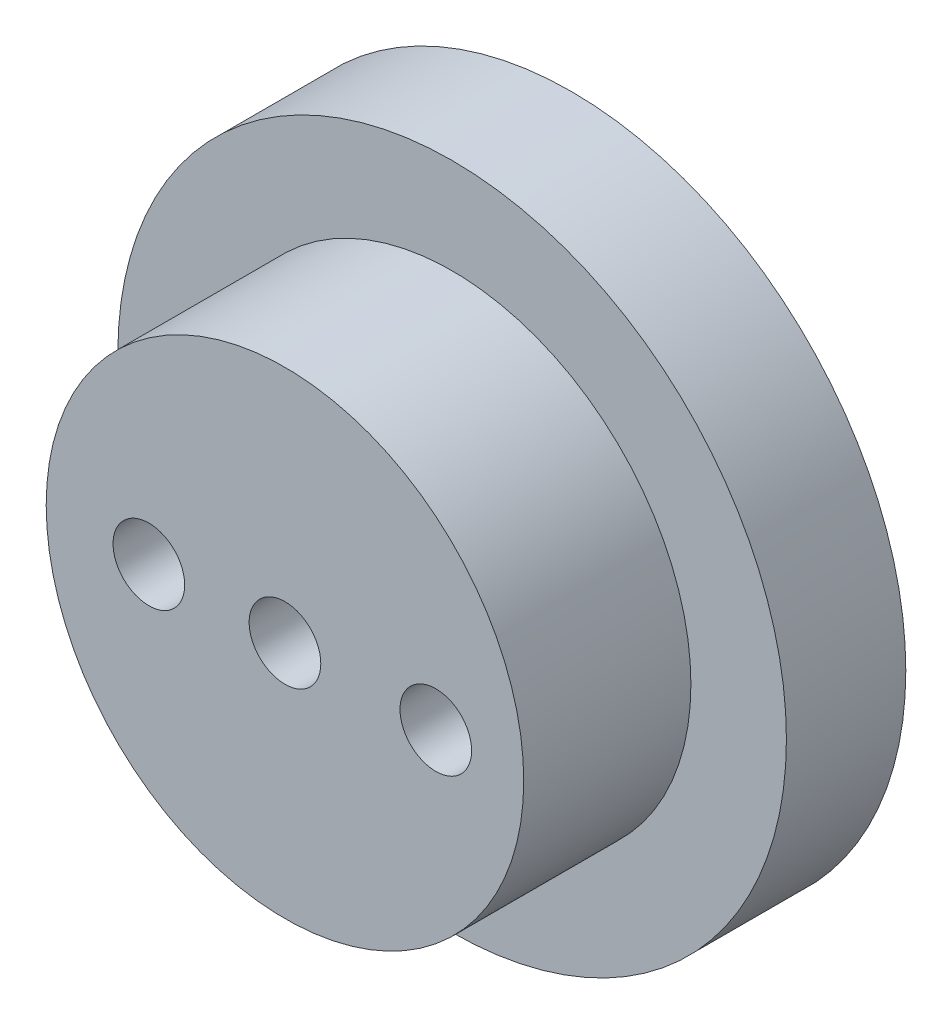
ISO-10303-21;
HEADER;
FILE_DESCRIPTION(('STEP AP214'),'2;1');
FILE_NAME('part.step','',(''),(''),'','','');
FILE_SCHEMA(('AUTOMOTIVE_DESIGN { 1 0 10303 214 1 1 1 1 }'));
ENDSEC;
DATA;
#1=APPLICATION_CONTEXT('core data for automotive mechanical design processes');
#2=APPLICATION_PROTOCOL_DEFINITION('international standard','automotive_design',2000,#1);
#3=PRODUCT_CONTEXT('',#1,'mechanical');
#4=PRODUCT('Part','Part','',(#3));
#5=PRODUCT_RELATED_PRODUCT_CATEGORY('part','',(#4));
#6=PRODUCT_DEFINITION_FORMATION('','',#4);
#7=PRODUCT_DEFINITION_CONTEXT('part definition',#1,'design');
#8=PRODUCT_DEFINITION('design','',#6,#7);
#9=PRODUCT_DEFINITION_SHAPE('','',#8);
#10=(LENGTH_UNIT() NAMED_UNIT(*) SI_UNIT(.MILLI.,.METRE.));
#11=(NAMED_UNIT(*) PLANE_ANGLE_UNIT() SI_UNIT($,.RADIAN.));
#12=(NAMED_UNIT(*) SI_UNIT($,.STERADIAN.) SOLID_ANGLE_UNIT());
#13=UNCERTAINTY_MEASURE_WITH_UNIT(LENGTH_MEASURE(1.E-05),#10,'distance_accuracy_value','');
#14=(GEOMETRIC_REPRESENTATION_CONTEXT(3) GLOBAL_UNCERTAINTY_ASSIGNED_CONTEXT((#13)) GLOBAL_UNIT_ASSIGNED_CONTEXT((#10,
#11,#12)) REPRESENTATION_CONTEXT('',''));
#15=CARTESIAN_POINT('',(0.,0.,0.));
#16=DIRECTION('',(0.,0.,1.));
#17=DIRECTION('',(1.,0.,0.));
#18=AXIS2_PLACEMENT_3D('',#15,#16,#17);
#19=CARTESIAN_POINT('',(0.,0.,5.));
#20=DIRECTION('',(0.,0.,-1.));
#21=DIRECTION('',(-1.,0.,0.));
#22=AXIS2_PLACEMENT_3D('',#19,#20,#21);
#23=CYLINDRICAL_SURFACE('',#22,14.);
#24=CARTESIAN_POINT('',(0.,0.,5.));
#25=DIRECTION('',(0.,0.,1.));
#26=DIRECTION('',(1.,0.,0.));
#27=AXIS2_PLACEMENT_3D('',#24,#25,#26);
#28=CIRCLE('',#27,14.);
#29=CARTESIAN_POINT('',(14.,0.,5.));
#30=VERTEX_POINT('',#29);
#31=EDGE_CURVE('E45',#30,#30,#28,.T.);
#32=ORIENTED_EDGE('',*,*,#31,.F.);
#33=EDGE_LOOP('',(#32));
#34=FACE_BOUND('',#33,.T.);
#35=CARTESIAN_POINT('',(0.,0.,0.));
#36=DIRECTION('',(0.,0.,1.));
#37=DIRECTION('',(1.,0.,0.));
#38=AXIS2_PLACEMENT_3D('',#35,#36,#37);
#39=CIRCLE('',#38,14.);
#40=CARTESIAN_POINT('',(14.,0.,0.));
#41=VERTEX_POINT('',#40);
#42=EDGE_CURVE('E40',#41,#41,#39,.T.);
#43=ORIENTED_EDGE('',*,*,#42,.T.);
#44=EDGE_LOOP('',(#43));
#45=FACE_BOUND('',#44,.T.);
#46=ADVANCED_FACE('F37',(#34,#45),#23,.T.);
#47=CARTESIAN_POINT('',(0.,0.,5.));
#48=DIRECTION('',(0.,0.,1.));
#49=DIRECTION('',(1.,0.,0.));
#50=AXIS2_PLACEMENT_3D('',#47,#48,#49);
#51=PLANE('',#50);
#52=CARTESIAN_POINT('',(0.,0.,5.));
#53=DIRECTION('',(0.,0.,1.));
#54=DIRECTION('',(1.,0.,0.));
#55=AXIS2_PLACEMENT_3D('',#52,#53,#54);
#56=CIRCLE('',#55,10.);
#57=CARTESIAN_POINT('',(10.,0.,5.));
#58=VERTEX_POINT('',#57);
#59=EDGE_CURVE('E10',#58,#58,#56,.T.);
#60=ORIENTED_EDGE('',*,*,#59,.F.);
#61=EDGE_LOOP('',(#60));
#62=FACE_BOUND('',#61,.T.);
#63=ORIENTED_EDGE('',*,*,#31,.T.);
#64=EDGE_LOOP('',(#63));
#65=FACE_BOUND('',#64,.T.);
#66=ADVANCED_FACE('F102',(#62,#65),#51,.T.);
#67=CARTESIAN_POINT('',(0.,0.,0.));
#68=DIRECTION('',(0.,0.,1.));
#69=DIRECTION('',(1.,0.,0.));
#70=AXIS2_PLACEMENT_3D('',#67,#68,#69);
#71=PLANE('',#70);
#72=CARTESIAN_POINT('',(-5.69970402611893,0.,0.));
#73=DIRECTION('',(0.,0.,1.));
#74=DIRECTION('',(1.,0.,0.));
#75=AXIS2_PLACEMENT_3D('',#72,#73,#74);
#76=CIRCLE('',#75,1.5);
#77=CARTESIAN_POINT('',(-4.19970402611893,0.,0.));
#78=VERTEX_POINT('',#77);
#79=EDGE_CURVE('E61',#78,#78,#76,.F.);
#80=ORIENTED_EDGE('',*,*,#79,.F.);
#81=EDGE_LOOP('',(#80));
#82=FACE_BOUND('',#81,.T.);
#83=CARTESIAN_POINT('',(6.31695482371653,0.,0.));
#84=DIRECTION('',(0.,0.,1.));
#85=DIRECTION('',(1.,0.,0.));
#86=AXIS2_PLACEMENT_3D('',#83,#84,#85);
#87=CIRCLE('',#86,1.5);
#88=CARTESIAN_POINT('',(7.81695482371653,0.,0.));
#89=VERTEX_POINT('',#88);
#90=EDGE_CURVE('E70',#89,#89,#87,.F.);
#91=ORIENTED_EDGE('',*,*,#90,.F.);
#92=EDGE_LOOP('',(#91));
#93=FACE_BOUND('',#92,.T.);
#94=CARTESIAN_POINT('',(0.,0.,0.));
#95=DIRECTION('',(0.,0.,1.));
#96=DIRECTION('',(1.,0.,0.));
#97=AXIS2_PLACEMENT_3D('',#94,#95,#96);
#98=CIRCLE('',#97,1.5);
#99=CARTESIAN_POINT('',(1.5,0.,0.));
#100=VERTEX_POINT('',#99);
#101=EDGE_CURVE('E56',#100,#100,#98,.T.);
#102=ORIENTED_EDGE('',*,*,#101,.T.);
#103=EDGE_LOOP('',(#102));
#104=FACE_BOUND('',#103,.T.);
#105=ORIENTED_EDGE('',*,*,#42,.F.);
#106=EDGE_LOOP('',(#105));
#107=FACE_BOUND('',#106,.T.);
#108=ADVANCED_FACE('F97',(#82,#93,#104,#107),#71,.F.);
#109=CARTESIAN_POINT('',(0.,0.,12.));
#110=DIRECTION('',(0.,0.,-1.));
#111=DIRECTION('',(-1.,0.,0.));
#112=AXIS2_PLACEMENT_3D('',#109,#110,#111);
#113=CYLINDRICAL_SURFACE('',#112,10.);
#114=CARTESIAN_POINT('',(0.,0.,12.));
#115=DIRECTION('',(0.,0.,1.));
#116=DIRECTION('',(1.,0.,0.));
#117=AXIS2_PLACEMENT_3D('',#114,#115,#116);
#118=CIRCLE('',#117,10.);
#119=CARTESIAN_POINT('',(10.,0.,12.));
#120=VERTEX_POINT('',#119);
#121=EDGE_CURVE('E52',#120,#120,#118,.T.);
#122=ORIENTED_EDGE('',*,*,#121,.F.);
#123=EDGE_LOOP('',(#122));
#124=FACE_BOUND('',#123,.T.);
#125=ORIENTED_EDGE('',*,*,#59,.T.);
#126=EDGE_LOOP('',(#125));
#127=FACE_BOUND('',#126,.T.);
#128=ADVANCED_FACE('F88',(#124,#127),#113,.T.);
#129=CARTESIAN_POINT('',(0.,0.,12.));
#130=DIRECTION('',(0.,0.,1.));
#131=DIRECTION('',(1.,0.,0.));
#132=AXIS2_PLACEMENT_3D('',#129,#130,#131);
#133=PLANE('',#132);
#134=CARTESIAN_POINT('',(-5.69970402611893,0.,12.));
#135=DIRECTION('',(0.,0.,1.));
#136=DIRECTION('',(1.,0.,0.));
#137=AXIS2_PLACEMENT_3D('',#134,#135,#136);
#138=CIRCLE('',#137,1.5);
#139=CARTESIAN_POINT('',(-4.19970402611893,0.,12.));
#140=VERTEX_POINT('',#139);
#141=EDGE_CURVE('E69',#140,#140,#138,.T.);
#142=ORIENTED_EDGE('',*,*,#141,.F.);
#143=EDGE_LOOP('',(#142));
#144=FACE_BOUND('',#143,.T.);
#145=CARTESIAN_POINT('',(6.31695482371653,0.,12.));
#146=DIRECTION('',(0.,0.,1.));
#147=DIRECTION('',(1.,0.,0.));
#148=AXIS2_PLACEMENT_3D('',#145,#146,#147);
#149=CIRCLE('',#148,1.5);
#150=CARTESIAN_POINT('',(7.81695482371653,0.,12.));
#151=VERTEX_POINT('',#150);
#152=EDGE_CURVE('E65',#151,#151,#149,.T.);
#153=ORIENTED_EDGE('',*,*,#152,.F.);
#154=EDGE_LOOP('',(#153));
#155=FACE_BOUND('',#154,.T.);
#156=CARTESIAN_POINT('',(0.,0.,12.));
#157=DIRECTION('',(0.,0.,1.));
#158=DIRECTION('',(1.,0.,0.));
#159=AXIS2_PLACEMENT_3D('',#156,#157,#158);
#160=CIRCLE('',#159,1.5);
#161=CARTESIAN_POINT('',(1.5,0.,12.));
#162=VERTEX_POINT('',#161);
#163=EDGE_CURVE('E57',#162,#162,#160,.T.);
#164=ORIENTED_EDGE('',*,*,#163,.F.);
#165=EDGE_LOOP('',(#164));
#166=FACE_BOUND('',#165,.T.);
#167=ORIENTED_EDGE('',*,*,#121,.T.);
#168=EDGE_LOOP('',(#167));
#169=FACE_BOUND('',#168,.T.);
#170=ADVANCED_FACE('F84',(#144,#155,#166,#169),#133,.T.);
#171=CARTESIAN_POINT('',(0.,0.,0.));
#172=DIRECTION('',(0.,0.,1.));
#173=DIRECTION('',(1.,0.,0.));
#174=AXIS2_PLACEMENT_3D('',#171,#172,#173);
#175=CYLINDRICAL_SURFACE('',#174,1.5);
#176=ORIENTED_EDGE('',*,*,#101,.F.);
#177=EDGE_LOOP('',(#176));
#178=FACE_BOUND('',#177,.T.);
#179=ORIENTED_EDGE('',*,*,#163,.T.);
#180=EDGE_LOOP('',(#179));
#181=FACE_BOUND('',#180,.T.);
#182=ADVANCED_FACE('F87',(#178,#181),#175,.F.);
#183=CARTESIAN_POINT('',(6.31695482371653,0.,-0.000999999999999265));
#184=DIRECTION('',(0.,0.,1.));
#185=DIRECTION('',(1.,0.,0.));
#186=AXIS2_PLACEMENT_3D('',#183,#184,#185);
#187=CYLINDRICAL_SURFACE('',#186,1.5);
#188=ORIENTED_EDGE('',*,*,#152,.T.);
#189=EDGE_LOOP('',(#188));
#190=FACE_BOUND('',#189,.T.);
#191=ORIENTED_EDGE('',*,*,#90,.T.);
#192=EDGE_LOOP('',(#191));
#193=FACE_BOUND('',#192,.T.);
#194=ADVANCED_FACE('F140',(#190,#193),#187,.F.);
#195=CARTESIAN_POINT('',(-5.69970402611893,0.,-0.000999999999999265));
#196=DIRECTION('',(0.,0.,1.));
#197=DIRECTION('',(1.,0.,0.));
#198=AXIS2_PLACEMENT_3D('',#195,#196,#197);
#199=CYLINDRICAL_SURFACE('',#198,1.5);
#200=ORIENTED_EDGE('',*,*,#141,.T.);
#201=EDGE_LOOP('',(#200));
#202=FACE_BOUND('',#201,.T.);
#203=ORIENTED_EDGE('',*,*,#79,.T.);
#204=EDGE_LOOP('',(#203));
#205=FACE_BOUND('',#204,.T.);
#206=ADVANCED_FACE('F81',(#202,#205),#199,.F.);
#207=CLOSED_SHELL('',(#46,#66,#108,#128,#170,#182,#194,#206));
#208=MANIFOLD_SOLID_BREP('B2',#207);
#209=ADVANCED_BREP_SHAPE_REPRESENTATION('',(#18,#208),#14);
#210=SHAPE_DEFINITION_REPRESENTATION(#9,#209);
ENDSEC;
END-ISO-10303-21;
